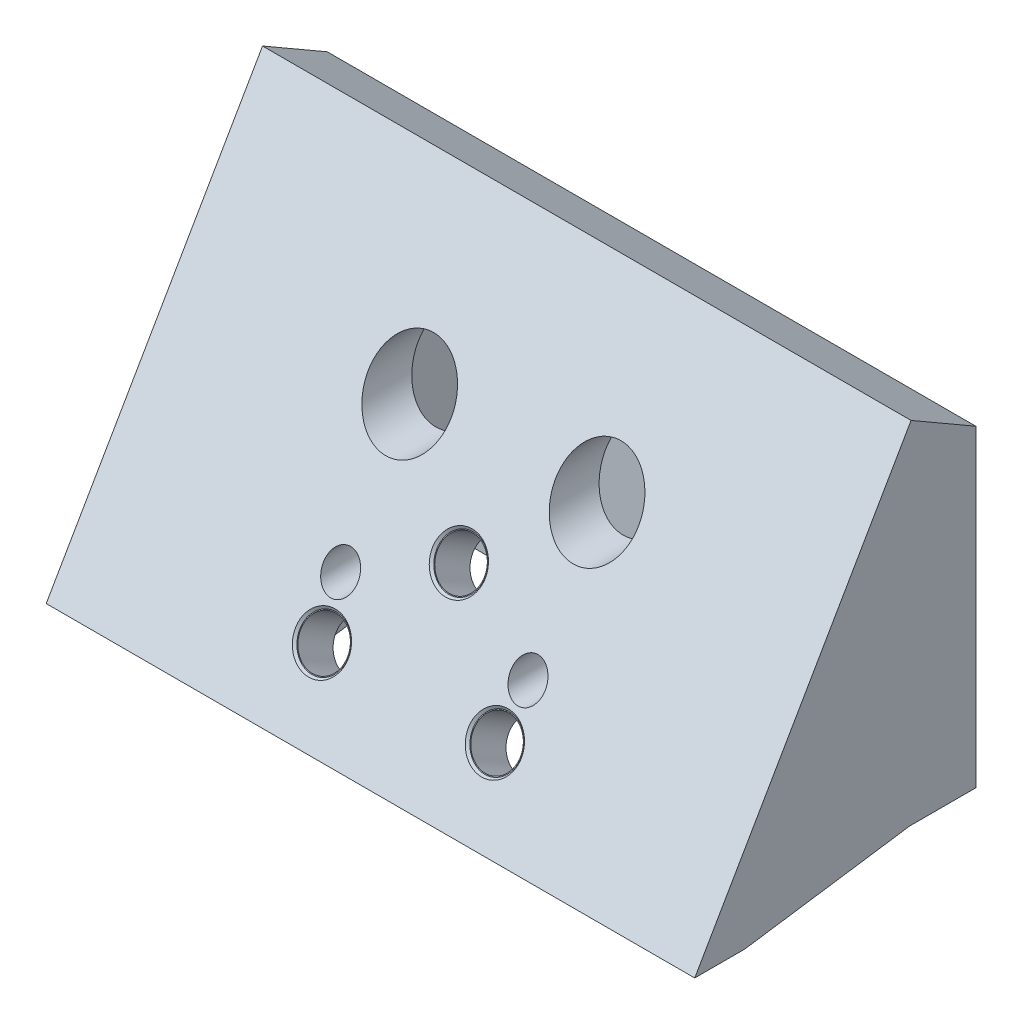
ISO-10303-21;
HEADER;
FILE_DESCRIPTION(('STEP AP214'),'2;1');
FILE_NAME('part.step','',(''),(''),'','','');
FILE_SCHEMA(('AUTOMOTIVE_DESIGN { 1 0 10303 214 1 1 1 1 }'));
ENDSEC;
DATA;
#1=APPLICATION_CONTEXT('core data for automotive mechanical design processes');
#2=APPLICATION_PROTOCOL_DEFINITION('international standard','automotive_design',2000,#1);
#3=PRODUCT_CONTEXT('',#1,'mechanical');
#4=PRODUCT('Part','Part','',(#3));
#5=PRODUCT_RELATED_PRODUCT_CATEGORY('part','',(#4));
#6=PRODUCT_DEFINITION_FORMATION('','',#4);
#7=PRODUCT_DEFINITION_CONTEXT('part definition',#1,'design');
#8=PRODUCT_DEFINITION('design','',#6,#7);
#9=PRODUCT_DEFINITION_SHAPE('','',#8);
#10=(LENGTH_UNIT() NAMED_UNIT(*) SI_UNIT(.MILLI.,.METRE.));
#11=(NAMED_UNIT(*) PLANE_ANGLE_UNIT() SI_UNIT($,.RADIAN.));
#12=(NAMED_UNIT(*) SI_UNIT($,.STERADIAN.) SOLID_ANGLE_UNIT());
#13=UNCERTAINTY_MEASURE_WITH_UNIT(LENGTH_MEASURE(1.E-05),#10,'distance_accuracy_value','');
#14=(GEOMETRIC_REPRESENTATION_CONTEXT(3) GLOBAL_UNCERTAINTY_ASSIGNED_CONTEXT((#13)) GLOBAL_UNIT_ASSIGNED_CONTEXT((#10,
#11,#12)) REPRESENTATION_CONTEXT('',''));
#15=CARTESIAN_POINT('',(0.,0.,0.));
#16=DIRECTION('',(0.,0.,1.));
#17=DIRECTION('',(1.,0.,0.));
#18=AXIS2_PLACEMENT_3D('',#15,#16,#17);
#19=CARTESIAN_POINT('',(20.,3.35000000000049,0.));
#20=DIRECTION('',(0.,-1.,0.));
#21=DIRECTION('',(0.,0.,-1.));
#22=AXIS2_PLACEMENT_3D('',#19,#20,#21);
#23=PLANE('',#22);
#24=DIRECTION('',(-1.,0.,0.));
#25=VECTOR('',#24,1.);
#26=CARTESIAN_POINT('',(20.,3.35000000000048,-26.0785448088665));
#27=LINE('',#26,#25);
#28=CARTESIAN_POINT('',(20.,3.35000000000048,-26.0785448088665));
#29=VERTEX_POINT('',#28);
#30=CARTESIAN_POINT('',(-20.,3.35000000000048,-26.0785448088665));
#31=VERTEX_POINT('',#30);
#32=EDGE_CURVE('E279',#29,#31,#27,.T.);
#33=ORIENTED_EDGE('',*,*,#32,.T.);
#34=DIRECTION('',(0.,0.,1.));
#35=VECTOR('',#34,1.);
#36=CARTESIAN_POINT('',(-20.,3.35000000000049,0.));
#37=LINE('',#36,#35);
#38=CARTESIAN_POINT('',(-20.,3.35000000000048,-22.9035448088665));
#39=VERTEX_POINT('',#38);
#40=EDGE_CURVE('E174',#31,#39,#37,.T.);
#41=ORIENTED_EDGE('',*,*,#40,.T.);
#42=DIRECTION('',(1.,0.,0.));
#43=VECTOR('',#42,1.);
#44=CARTESIAN_POINT('',(-45.,3.35000000000048,-22.9035448088665));
#45=LINE('',#44,#43);
#46=CARTESIAN_POINT('',(-45.,3.35000000000048,-22.9035448088665));
#47=VERTEX_POINT('',#46);
#48=EDGE_CURVE('E167',#47,#39,#45,.T.);
#49=ORIENTED_EDGE('',*,*,#48,.F.);
#50=DIRECTION('',(0.,0.,1.));
#51=VECTOR('',#50,1.);
#52=CARTESIAN_POINT('',(-45.,3.35000000000049,0.));
#53=LINE('',#52,#51);
#54=CARTESIAN_POINT('',(-45.,3.35000000000048,-32.0785448088665));
#55=VERTEX_POINT('',#54);
#56=EDGE_CURVE('E153',#55,#47,#53,.T.);
#57=ORIENTED_EDGE('',*,*,#56,.F.);
#58=DIRECTION('',(-1.,0.,0.));
#59=VECTOR('',#58,1.);
#60=CARTESIAN_POINT('',(20.,3.35000000000048,-32.0785448088665));
#61=LINE('',#60,#59);
#62=CARTESIAN_POINT('',(45.,3.35000000000048,-32.0785448088665));
#63=VERTEX_POINT('',#62);
#64=EDGE_CURVE('E304',#63,#55,#61,.T.);
#65=ORIENTED_EDGE('',*,*,#64,.F.);
#66=DIRECTION('',(0.,0.,-1.));
#67=VECTOR('',#66,1.);
#68=CARTESIAN_POINT('',(45.,3.35000000000049,0.));
#69=LINE('',#68,#67);
#70=CARTESIAN_POINT('',(45.,3.35000000000048,-22.9035448088665));
#71=VERTEX_POINT('',#70);
#72=EDGE_CURVE('E200',#71,#63,#69,.T.);
#73=ORIENTED_EDGE('',*,*,#72,.F.);
#74=DIRECTION('',(-1.,0.,0.));
#75=VECTOR('',#74,1.);
#76=CARTESIAN_POINT('',(45.,3.35000000000048,-22.9035448088665));
#77=LINE('',#76,#75);
#78=CARTESIAN_POINT('',(20.,3.35000000000048,-22.9035448088665));
#79=VERTEX_POINT('',#78);
#80=EDGE_CURVE('E205',#71,#79,#77,.T.);
#81=ORIENTED_EDGE('',*,*,#80,.T.);
#82=DIRECTION('',(0.,0.,-1.));
#83=VECTOR('',#82,1.);
#84=CARTESIAN_POINT('',(20.,3.35000000000049,0.));
#85=LINE('',#84,#83);
#86=EDGE_CURVE('E186',#79,#29,#85,.T.);
#87=ORIENTED_EDGE('',*,*,#86,.T.);
#88=EDGE_LOOP('',(#33,#41,#49,#57,#65,#73,#81,#87));
#89=FACE_BOUND('',#88,.T.);
#90=ADVANCED_FACE('F36',(#89),#23,.T.);
#91=CARTESIAN_POINT('',(20.,0.,-32.0785448088665));
#92=DIRECTION('',(0.,0.,-1.));
#93=DIRECTION('',(0.,1.,0.));
#94=AXIS2_PLACEMENT_3D('',#91,#92,#93);
#95=PLANE('',#94);
#96=CARTESIAN_POINT('',(13.,15.3500000000005,-32.0785448088665));
#97=DIRECTION('',(0.,0.,-1.));
#98=DIRECTION('',(-1.,0.,0.));
#99=AXIS2_PLACEMENT_3D('',#96,#97,#98);
#100=CIRCLE('',#99,2.8067);
#101=CARTESIAN_POINT('',(10.1933,15.3500000000005,-32.0785448088665));
#102=VERTEX_POINT('',#101);
#103=EDGE_CURVE('E255',#102,#102,#100,.T.);
#104=ORIENTED_EDGE('',*,*,#103,.F.);
#105=EDGE_LOOP('',(#104));
#106=FACE_BOUND('',#105,.T.);
#107=CARTESIAN_POINT('',(13.,31.9500000000005,-32.0785448088665));
#108=DIRECTION('',(0.,0.,-1.));
#109=DIRECTION('',(-1.,0.,0.));
#110=AXIS2_PLACEMENT_3D('',#107,#108,#109);
#111=CIRCLE('',#110,2.8067);
#112=CARTESIAN_POINT('',(10.1933,31.9500000000005,-32.0785448088665));
#113=VERTEX_POINT('',#112);
#114=EDGE_CURVE('E259',#113,#113,#111,.T.);
#115=ORIENTED_EDGE('',*,*,#114,.F.);
#116=EDGE_LOOP('',(#115));
#117=FACE_BOUND('',#116,.T.);
#118=CARTESIAN_POINT('',(-13.,31.9500000000005,-32.0785448088665));
#119=DIRECTION('',(0.,0.,-1.));
#120=DIRECTION('',(-1.,0.,0.));
#121=AXIS2_PLACEMENT_3D('',#118,#119,#120);
#122=CIRCLE('',#121,2.8067);
#123=CARTESIAN_POINT('',(-15.8067,31.9500000000005,-32.0785448088665));
#124=VERTEX_POINT('',#123);
#125=EDGE_CURVE('E263',#124,#124,#122,.T.);
#126=ORIENTED_EDGE('',*,*,#125,.F.);
#127=EDGE_LOOP('',(#126));
#128=FACE_BOUND('',#127,.T.);
#129=CARTESIAN_POINT('',(-13.,15.3500000000005,-32.0785448088665));
#130=DIRECTION('',(0.,0.,-1.));
#131=DIRECTION('',(-1.,0.,0.));
#132=AXIS2_PLACEMENT_3D('',#129,#130,#131);
#133=CIRCLE('',#132,2.8067);
#134=CARTESIAN_POINT('',(-15.8067,15.3500000000005,-32.0785448088665));
#135=VERTEX_POINT('',#134);
#136=EDGE_CURVE('E267',#135,#135,#133,.T.);
#137=ORIENTED_EDGE('',*,*,#136,.F.);
#138=EDGE_LOOP('',(#137));
#139=FACE_BOUND('',#138,.T.);
#140=ORIENTED_EDGE('',*,*,#64,.T.);
#141=DIRECTION('',(0.,-1.,0.));
#142=VECTOR('',#141,1.);
#143=CARTESIAN_POINT('',(-45.,0.,-32.0785448088665));
#144=LINE('',#143,#142);
#145=CARTESIAN_POINT('',(-45.,46.8127768527227,-32.0785448088665));
#146=VERTEX_POINT('',#145);
#147=EDGE_CURVE('E179',#146,#55,#144,.T.);
#148=ORIENTED_EDGE('',*,*,#147,.F.);
#149=DIRECTION('',(-1.,0.,0.));
#150=VECTOR('',#149,1.);
#151=CARTESIAN_POINT('',(20.,46.8127768527227,-32.0785448088665));
#152=LINE('',#151,#150);
#153=CARTESIAN_POINT('',(45.,46.8127768527227,-32.0785448088665));
#154=VERTEX_POINT('',#153);
#155=EDGE_CURVE('E302',#154,#146,#152,.T.);
#156=ORIENTED_EDGE('',*,*,#155,.F.);
#157=DIRECTION('',(0.,1.,0.));
#158=VECTOR('',#157,1.);
#159=CARTESIAN_POINT('',(45.,0.,-32.0785448088665));
#160=LINE('',#159,#158);
#161=EDGE_CURVE('E197',#63,#154,#160,.T.);
#162=ORIENTED_EDGE('',*,*,#161,.F.);
#163=EDGE_LOOP('',(#140,#148,#156,#162));
#164=FACE_BOUND('',#163,.T.);
#165=ADVANCED_FACE('F374',(#106,#117,#128,#139,#164),#95,.T.);
#166=CARTESIAN_POINT('',(20.,49.,-28.2901631902915));
#167=DIRECTION('',(0.,-0.86602540378444,0.499999999999998));
#168=DIRECTION('',(0.,-0.499999999999998,-0.86602540378444));
#169=AXIS2_PLACEMENT_3D('',#166,#167,#168);
#170=PLANE('',#169);
#171=ORIENTED_EDGE('',*,*,#155,.T.);
#172=DIRECTION('',(0.,0.499999999999998,0.86602540378444));
#173=VECTOR('',#172,1.);
#174=CARTESIAN_POINT('',(-45.,48.9999999999999,-28.2901631902915));
#175=LINE('',#174,#173);
#176=CARTESIAN_POINT('',(-45.,52.,-23.0940107675848));
#177=VERTEX_POINT('',#176);
#178=EDGE_CURVE('E181',#146,#177,#175,.T.);
#179=ORIENTED_EDGE('',*,*,#178,.T.);
#180=DIRECTION('',(-1.,0.,0.));
#181=VECTOR('',#180,1.);
#182=CARTESIAN_POINT('',(20.,52.,-23.0940107675848));
#183=LINE('',#182,#181);
#184=CARTESIAN_POINT('',(45.,52.,-23.0940107675848));
#185=VERTEX_POINT('',#184);
#186=EDGE_CURVE('E300',#185,#177,#183,.T.);
#187=ORIENTED_EDGE('',*,*,#186,.F.);
#188=DIRECTION('',(0.,-0.499999999999998,-0.86602540378444));
#189=VECTOR('',#188,1.);
#190=CARTESIAN_POINT('',(45.,48.9999999999999,-28.2901631902915));
#191=LINE('',#190,#189);
#192=EDGE_CURVE('E194',#185,#154,#191,.T.);
#193=ORIENTED_EDGE('',*,*,#192,.T.);
#194=EDGE_LOOP('',(#171,#179,#187,#193));
#195=FACE_BOUND('',#194,.T.);
#196=ADVANCED_FACE('F353',(#195),#170,.F.);
#197=CARTESIAN_POINT('',(20.,3.00000000000003,5.19615242270671));
#198=DIRECTION('',(0.,0.499999999999998,0.86602540378444));
#199=DIRECTION('',(0.,-0.86602540378444,0.499999999999998));
#200=AXIS2_PLACEMENT_3D('',#197,#198,#199);
#201=PLANE('',#200);
#202=CARTESIAN_POINT('',(12.,9.12435565298219,1.66025403784448));
#203=DIRECTION('',(0.,0.499999999999998,0.86602540378444));
#204=DIRECTION('',(0.,-0.86602540378444,0.499999999999998));
#205=AXIS2_PLACEMENT_3D('',#202,#203,#204);
#206=CIRCLE('',#205,3.67891460743347);
#207=CARTESIAN_POINT('',(12.,5.93832214459114,3.49971134156121));
#208=VERTEX_POINT('',#207);
#209=EDGE_CURVE('E39',#208,#208,#206,.T.);
#210=ORIENTED_EDGE('',*,*,#209,.F.);
#211=EDGE_LOOP('',(#210));
#212=FACE_BOUND('',#211,.T.);
#213=CARTESIAN_POINT('',(-12.,9.12435565298219,1.66025403784448));
#214=DIRECTION('',(0.,0.499999999999998,0.86602540378444));
#215=DIRECTION('',(0.,-0.86602540378444,0.499999999999998));
#216=AXIS2_PLACEMENT_3D('',#213,#214,#215);
#217=CIRCLE('',#216,3.67891460743347);
#218=CARTESIAN_POINT('',(-12.,5.93832214459114,3.49971134156121));
#219=VERTEX_POINT('',#218);
#220=EDGE_CURVE('E231',#219,#219,#217,.T.);
#221=ORIENTED_EDGE('',*,*,#220,.F.);
#222=EDGE_LOOP('',(#221));
#223=FACE_BOUND('',#222,.T.);
#224=CARTESIAN_POINT('',(0.,21.2487113059643,-5.33974596215549));
#225=DIRECTION('',(0.,0.499999999999998,0.86602540378444));
#226=DIRECTION('',(0.,-0.86602540378444,0.499999999999998));
#227=AXIS2_PLACEMENT_3D('',#224,#225,#226);
#228=CIRCLE('',#227,3.67891460743347);
#229=CARTESIAN_POINT('',(0.,18.0626777975733,-3.50028865843877));
#230=VERTEX_POINT('',#229);
#231=EDGE_CURVE('E237',#230,#230,#228,.T.);
#232=ORIENTED_EDGE('',*,*,#231,.F.);
#233=EDGE_LOOP('',(#232));
#234=FACE_BOUND('',#233,.T.);
#235=CARTESIAN_POINT('',(13.,31.9500000000005,-11.5181378703331));
#236=DIRECTION('',(0.,0.499999999999998,0.86602540378444));
#237=DIRECTION('',(0.,0.86602540378444,-0.499999999999998));
#238=AXIS2_PLACEMENT_3D('',#235,#236,#237);
#239=ELLIPSE('',#238,6.63952809568069,5.75);
#240=CARTESIAN_POINT('',(13.,37.7000000000005,-14.8379019181735));
#241=VERTEX_POINT('',#240);
#242=EDGE_CURVE('E236',#241,#241,#239,.T.);
#243=ORIENTED_EDGE('',*,*,#242,.F.);
#244=EDGE_LOOP('',(#243));
#245=FACE_BOUND('',#244,.T.);
#246=CARTESIAN_POINT('',(-13.,31.9500000000005,-11.5181378703331));
#247=DIRECTION('',(0.,0.499999999999998,0.86602540378444));
#248=DIRECTION('',(0.,0.86602540378444,-0.499999999999998));
#249=AXIS2_PLACEMENT_3D('',#246,#247,#248);
#250=ELLIPSE('',#249,6.63952809568069,5.75);
#251=CARTESIAN_POINT('',(-13.,37.7000000000005,-14.8379019181735));
#252=VERTEX_POINT('',#251);
#253=EDGE_CURVE('E244',#252,#252,#250,.T.);
#254=ORIENTED_EDGE('',*,*,#253,.F.);
#255=EDGE_LOOP('',(#254));
#256=FACE_BOUND('',#255,.T.);
#257=CARTESIAN_POINT('',(-13.,15.3500000000005,-1.93412340178539));
#258=DIRECTION('',(0.,0.499999999999998,0.86602540378444));
#259=DIRECTION('',(0.,0.86602540378444,-0.499999999999998));
#260=AXIS2_PLACEMENT_3D('',#257,#258,#259);
#261=ELLIPSE('',#260,2.77128129211019,2.39999999999999);
#262=CARTESIAN_POINT('',(-13.,17.7500000000005,-3.31976404784048));
#263=VERTEX_POINT('',#262);
#264=EDGE_CURVE('E248',#263,#263,#261,.T.);
#265=ORIENTED_EDGE('',*,*,#264,.F.);
#266=EDGE_LOOP('',(#265));
#267=FACE_BOUND('',#266,.T.);
#268=CARTESIAN_POINT('',(13.,15.3500000000005,-1.93412340178539));
#269=DIRECTION('',(0.,0.499999999999998,0.86602540378444));
#270=DIRECTION('',(0.,0.86602540378444,-0.499999999999998));
#271=AXIS2_PLACEMENT_3D('',#268,#269,#270);
#272=ELLIPSE('',#271,2.77128129211019,2.39999999999999);
#273=CARTESIAN_POINT('',(13.,17.7500000000005,-3.31976404784048));
#274=VERTEX_POINT('',#273);
#275=EDGE_CURVE('E251',#274,#274,#272,.T.);
#276=ORIENTED_EDGE('',*,*,#275,.F.);
#277=EDGE_LOOP('',(#276));
#278=FACE_BOUND('',#277,.T.);
#279=ORIENTED_EDGE('',*,*,#186,.T.);
#280=DIRECTION('',(0.,0.86602540378444,-0.499999999999998));
#281=VECTOR('',#280,1.);
#282=CARTESIAN_POINT('',(-45.,3.00000000000003,5.19615242270671));
#283=LINE('',#282,#281);
#284=CARTESIAN_POINT('',(-45.,0.,6.9282032302756));
#285=VERTEX_POINT('',#284);
#286=EDGE_CURVE('E168',#285,#177,#283,.T.);
#287=ORIENTED_EDGE('',*,*,#286,.F.);
#288=DIRECTION('',(-1.,0.,0.));
#289=VECTOR('',#288,1.);
#290=CARTESIAN_POINT('',(20.,0.,6.9282032302756));
#291=LINE('',#290,#289);
#292=CARTESIAN_POINT('',(45.,0.,6.9282032302756));
#293=VERTEX_POINT('',#292);
#294=EDGE_CURVE('E172',#293,#285,#291,.T.);
#295=ORIENTED_EDGE('',*,*,#294,.F.);
#296=DIRECTION('',(0.,-0.86602540378444,0.499999999999998));
#297=VECTOR('',#296,1.);
#298=CARTESIAN_POINT('',(45.,3.00000000000003,5.19615242270671));
#299=LINE('',#298,#297);
#300=EDGE_CURVE('E190',#185,#293,#299,.T.);
#301=ORIENTED_EDGE('',*,*,#300,.F.);
#302=EDGE_LOOP('',(#279,#287,#295,#301));
#303=FACE_BOUND('',#302,.T.);
#304=ADVANCED_FACE('F350',(#212,#223,#234,#245,#256,#267,#278,#303),#201,.T.);
#305=CARTESIAN_POINT('',(20.,0.,0.));
#306=DIRECTION('',(0.,1.,0.));
#307=DIRECTION('',(0.,0.,1.));
#308=AXIS2_PLACEMENT_3D('',#305,#306,#307);
#309=PLANE('',#308);
#310=ORIENTED_EDGE('',*,*,#294,.T.);
#311=DIRECTION('',(0.,0.,-1.));
#312=VECTOR('',#311,1.);
#313=CARTESIAN_POINT('',(-45.,0.,0.));
#314=LINE('',#313,#312);
#315=CARTESIAN_POINT('',(-45.,0.,0.));
#316=VERTEX_POINT('',#315);
#317=EDGE_CURVE('E150',#285,#316,#314,.T.);
#318=ORIENTED_EDGE('',*,*,#317,.T.);
#319=DIRECTION('',(1.,0.,0.));
#320=VECTOR('',#319,1.);
#321=CARTESIAN_POINT('',(-45.,0.,0.));
#322=LINE('',#321,#320);
#323=CARTESIAN_POINT('',(-20.,0.,0.));
#324=VERTEX_POINT('',#323);
#325=EDGE_CURVE('E160',#316,#324,#322,.T.);
#326=ORIENTED_EDGE('',*,*,#325,.T.);
#327=DIRECTION('',(-1.,0.,0.));
#328=VECTOR('',#327,1.);
#329=CARTESIAN_POINT('',(20.,0.,0.));
#330=LINE('',#329,#328);
#331=CARTESIAN_POINT('',(20.,0.,0.));
#332=VERTEX_POINT('',#331);
#333=EDGE_CURVE('E296',#332,#324,#330,.T.);
#334=ORIENTED_EDGE('',*,*,#333,.F.);
#335=DIRECTION('',(-1.,0.,0.));
#336=VECTOR('',#335,1.);
#337=CARTESIAN_POINT('',(45.,0.,0.));
#338=LINE('',#337,#336);
#339=CARTESIAN_POINT('',(45.,0.,0.));
#340=VERTEX_POINT('',#339);
#341=EDGE_CURVE('E209',#340,#332,#338,.T.);
#342=ORIENTED_EDGE('',*,*,#341,.F.);
#343=DIRECTION('',(0.,0.,1.));
#344=VECTOR('',#343,1.);
#345=CARTESIAN_POINT('',(45.,0.,0.));
#346=LINE('',#345,#344);
#347=EDGE_CURVE('E188',#340,#293,#346,.T.);
#348=ORIENTED_EDGE('',*,*,#347,.T.);
#349=EDGE_LOOP('',(#310,#318,#326,#334,#342,#348));
#350=FACE_BOUND('',#349,.T.);
#351=ADVANCED_FACE('F170',(#350),#309,.F.);
#352=CARTESIAN_POINT('',(20.,0.,0.));
#353=DIRECTION('',(0.,0.499999999999996,0.866025403784441));
#354=DIRECTION('',(0.,-0.866025403784441,0.499999999999996));
#355=AXIS2_PLACEMENT_3D('',#352,#353,#354);
#356=PLANE('',#355);
#357=CARTESIAN_POINT('',(12.,6.12435565298217,-3.53589838486222));
#358=DIRECTION('',(0.,0.499999999999996,0.866025403784441));
#359=DIRECTION('',(0.,-0.866025403784441,0.499999999999996));
#360=AXIS2_PLACEMENT_3D('',#357,#358,#359);
#361=CIRCLE('',#360,3.2639);
#362=CARTESIAN_POINT('',(12.,3.29773533757013,-1.90394838486224));
#363=VERTEX_POINT('',#362);
#364=EDGE_CURVE('E219',#363,#363,#361,.T.);
#365=ORIENTED_EDGE('',*,*,#364,.T.);
#366=EDGE_LOOP('',(#365));
#367=FACE_BOUND('',#366,.T.);
#368=CARTESIAN_POINT('',(-12.,6.12435565298217,-3.53589838486222));
#369=DIRECTION('',(0.,0.499999999999996,0.866025403784441));
#370=DIRECTION('',(0.,-0.866025403784441,0.499999999999996));
#371=AXIS2_PLACEMENT_3D('',#368,#369,#370);
#372=CIRCLE('',#371,3.2639);
#373=CARTESIAN_POINT('',(-12.,3.29773533757013,-1.90394838486224));
#374=VERTEX_POINT('',#373);
#375=EDGE_CURVE('E226',#374,#374,#372,.T.);
#376=ORIENTED_EDGE('',*,*,#375,.T.);
#377=EDGE_LOOP('',(#376));
#378=FACE_BOUND('',#377,.T.);
#379=CARTESIAN_POINT('',(0.,18.2487113059643,-10.5358983848622));
#380=DIRECTION('',(0.,0.499999999999996,0.866025403784441));
#381=DIRECTION('',(0.,-0.866025403784441,0.499999999999996));
#382=AXIS2_PLACEMENT_3D('',#379,#380,#381);
#383=CIRCLE('',#382,3.2639);
#384=CARTESIAN_POINT('',(0.,15.4220909905523,-8.90394838486218));
#385=VERTEX_POINT('',#384);
#386=EDGE_CURVE('E234',#385,#385,#383,.T.);
#387=ORIENTED_EDGE('',*,*,#386,.T.);
#388=EDGE_LOOP('',(#387));
#389=FACE_BOUND('',#388,.T.);
#390=CARTESIAN_POINT('',(-13.,15.3500000000005,-8.86232663206094));
#391=DIRECTION('',(0.,0.499999999999996,0.866025403784441));
#392=DIRECTION('',(0.,0.866025403784441,-0.499999999999996));
#393=AXIS2_PLACEMENT_3D('',#390,#391,#392);
#394=ELLIPSE('',#393,2.77128129211019,2.39999999999999);
#395=CARTESIAN_POINT('',(-13.,17.7500000000005,-10.247967278116));
#396=VERTEX_POINT('',#395);
#397=EDGE_CURVE('E247',#396,#396,#394,.T.);
#398=ORIENTED_EDGE('',*,*,#397,.T.);
#399=EDGE_LOOP('',(#398));
#400=FACE_BOUND('',#399,.T.);
#401=CARTESIAN_POINT('',(13.,15.3500000000005,-8.86232663206094));
#402=DIRECTION('',(0.,0.499999999999996,0.866025403784441));
#403=DIRECTION('',(0.,0.866025403784441,-0.499999999999996));
#404=AXIS2_PLACEMENT_3D('',#401,#402,#403);
#405=ELLIPSE('',#404,2.77128129211019,2.39999999999999);
#406=CARTESIAN_POINT('',(13.,17.7500000000005,-10.247967278116));
#407=VERTEX_POINT('',#406);
#408=EDGE_CURVE('E252',#407,#407,#405,.T.);
#409=ORIENTED_EDGE('',*,*,#408,.T.);
#410=EDGE_LOOP('',(#409));
#411=FACE_BOUND('',#410,.T.);
#412=DIRECTION('',(-1.,0.,0.));
#413=VECTOR('',#412,1.);
#414=CARTESIAN_POINT('',(20.,37.5764973081042,-21.694800836037));
#415=LINE('',#414,#413);
#416=CARTESIAN_POINT('',(11.8146612121839,37.5764973081042,-21.694800836037));
#417=VERTEX_POINT('',#416);
#418=CARTESIAN_POINT('',(-11.8146612121838,37.5764973081042,-21.694800836037));
#419=VERTEX_POINT('',#418);
#420=EDGE_CURVE('E297',#417,#419,#415,.T.);
#421=ORIENTED_EDGE('',*,*,#420,.F.);
#422=CARTESIAN_POINT('',(13.,31.9500000000005,-18.4463411006086));
#423=DIRECTION('',(0.,0.499999999999996,0.866025403784441));
#424=DIRECTION('',(0.,0.866025403784441,-0.499999999999996));
#425=AXIS2_PLACEMENT_3D('',#422,#423,#424);
#426=ELLIPSE('',#425,6.63952809568068,5.75);
#427=CARTESIAN_POINT('',(14.1853387878162,37.5764973081042,-21.694800836037));
#428=VERTEX_POINT('',#427);
#429=EDGE_CURVE('E11',#417,#428,#426,.T.);
#430=ORIENTED_EDGE('',*,*,#429,.T.);
#431=CARTESIAN_POINT('',(20.,37.5764973081042,-21.694800836037));
#432=VERTEX_POINT('',#431);
#433=EDGE_CURVE('E293',#432,#428,#415,.T.);
#434=ORIENTED_EDGE('',*,*,#433,.F.);
#435=DIRECTION('',(0.,0.866025403784441,-0.499999999999996));
#436=VECTOR('',#435,1.);
#437=CARTESIAN_POINT('',(20.,0.,0.));
#438=LINE('',#437,#436);
#439=EDGE_CURVE('E271',#332,#432,#438,.T.);
#440=ORIENTED_EDGE('',*,*,#439,.F.);
#441=ORIENTED_EDGE('',*,*,#333,.T.);
#442=DIRECTION('',(0.,0.866025403784441,-0.499999999999996));
#443=VECTOR('',#442,1.);
#444=CARTESIAN_POINT('',(-20.,0.,0.));
#445=LINE('',#444,#443);
#446=CARTESIAN_POINT('',(-20.,37.5764973081042,-21.694800836037));
#447=VERTEX_POINT('',#446);
#448=EDGE_CURVE('E280',#324,#447,#445,.T.);
#449=ORIENTED_EDGE('',*,*,#448,.T.);
#450=CARTESIAN_POINT('',(-14.1853387878164,37.5764973081042,-21.694800836037));
#451=VERTEX_POINT('',#450);
#452=EDGE_CURVE('E292',#451,#447,#415,.T.);
#453=ORIENTED_EDGE('',*,*,#452,.F.);
#454=CARTESIAN_POINT('',(-13.,31.9500000000005,-18.4463411006086));
#455=DIRECTION('',(0.,0.499999999999996,0.866025403784441));
#456=DIRECTION('',(0.,0.866025403784441,-0.499999999999996));
#457=AXIS2_PLACEMENT_3D('',#454,#455,#456);
#458=ELLIPSE('',#457,6.63952809568068,5.75);
#459=EDGE_CURVE('E59',#451,#419,#458,.T.);
#460=ORIENTED_EDGE('',*,*,#459,.T.);
#461=EDGE_LOOP('',(#421,#430,#434,#440,#441,#449,#453,#460));
#462=FACE_BOUND('',#461,.T.);
#463=ADVANCED_FACE('F383',(#367,#378,#389,#400,#411,#462),#356,.F.);
#464=CARTESIAN_POINT('',(20.,37.5764973081043,-2.15710964407993E-13));
#465=DIRECTION('',(0.,1.,0.));
#466=DIRECTION('',(0.,0.,1.));
#467=AXIS2_PLACEMENT_3D('',#464,#465,#466);
#468=PLANE('',#467);
#469=ORIENTED_EDGE('',*,*,#433,.T.);
#470=DIRECTION('',(0.,0.,-1.));
#471=VECTOR('',#470,1.);
#472=CARTESIAN_POINT('',(14.1853387878165,37.5764973081042,-32.0785448088665));
#473=LINE('',#472,#471);
#474=CARTESIAN_POINT('',(14.1853387878162,37.5764973081042,-22.9035448088665));
#475=VERTEX_POINT('',#474);
#476=EDGE_CURVE('E44',#428,#475,#473,.T.);
#477=ORIENTED_EDGE('',*,*,#476,.T.);
#478=DIRECTION('',(-1.,0.,0.));
#479=VECTOR('',#478,1.);
#480=CARTESIAN_POINT('',(20.,37.5764973081042,-22.9035448088665));
#481=LINE('',#480,#479);
#482=CARTESIAN_POINT('',(11.8146612121838,37.5764973081042,-22.9035448088665));
#483=VERTEX_POINT('',#482);
#484=EDGE_CURVE('E326',#475,#483,#481,.T.);
#485=ORIENTED_EDGE('',*,*,#484,.T.);
#486=DIRECTION('',(0.,0.,-1.));
#487=VECTOR('',#486,1.);
#488=CARTESIAN_POINT('',(11.8146612121835,37.5764973081042,-32.0785448088665));
#489=LINE('',#488,#487);
#490=EDGE_CURVE('E329',#483,#417,#489,.F.);
#491=ORIENTED_EDGE('',*,*,#490,.T.);
#492=ORIENTED_EDGE('',*,*,#420,.T.);
#493=DIRECTION('',(0.,0.,-1.));
#494=VECTOR('',#493,1.);
#495=CARTESIAN_POINT('',(-11.8146612121836,37.5764973081042,-32.0785448088665));
#496=LINE('',#495,#494);
#497=CARTESIAN_POINT('',(-11.8146612121836,37.5764973081042,-22.9035448088665));
#498=VERTEX_POINT('',#497);
#499=EDGE_CURVE('E323',#419,#498,#496,.T.);
#500=ORIENTED_EDGE('',*,*,#499,.T.);
#501=DIRECTION('',(-1.,0.,0.));
#502=VECTOR('',#501,1.);
#503=CARTESIAN_POINT('',(20.,37.5764973081042,-22.9035448088665));
#504=LINE('',#503,#502);
#505=CARTESIAN_POINT('',(-14.1853387878164,37.5764973081042,-22.9035448088665));
#506=VERTEX_POINT('',#505);
#507=EDGE_CURVE('E320',#498,#506,#504,.T.);
#508=ORIENTED_EDGE('',*,*,#507,.T.);
#509=DIRECTION('',(0.,0.,-1.));
#510=VECTOR('',#509,1.);
#511=CARTESIAN_POINT('',(-14.1853387878164,37.5764973081042,-32.0785448088665));
#512=LINE('',#511,#510);
#513=EDGE_CURVE('E306',#506,#451,#512,.F.);
#514=ORIENTED_EDGE('',*,*,#513,.T.);
#515=ORIENTED_EDGE('',*,*,#452,.T.);
#516=DIRECTION('',(0.,0.,-1.));
#517=VECTOR('',#516,1.);
#518=CARTESIAN_POINT('',(-20.,37.5764973081043,-2.15710964407993E-13));
#519=LINE('',#518,#517);
#520=CARTESIAN_POINT('',(-20.,37.5764973081042,-26.0785448088665));
#521=VERTEX_POINT('',#520);
#522=EDGE_CURVE('E283',#447,#521,#519,.T.);
#523=ORIENTED_EDGE('',*,*,#522,.T.);
#524=DIRECTION('',(-1.,0.,0.));
#525=VECTOR('',#524,1.);
#526=CARTESIAN_POINT('',(20.,37.5764973081042,-26.0785448088665));
#527=LINE('',#526,#525);
#528=CARTESIAN_POINT('',(20.,37.5764973081042,-26.0785448088665));
#529=VERTEX_POINT('',#528);
#530=EDGE_CURVE('E289',#529,#521,#527,.T.);
#531=ORIENTED_EDGE('',*,*,#530,.F.);
#532=DIRECTION('',(0.,0.,-1.));
#533=VECTOR('',#532,1.);
#534=CARTESIAN_POINT('',(20.,37.5764973081043,-2.15710964407993E-13));
#535=LINE('',#534,#533);
#536=EDGE_CURVE('E273',#432,#529,#535,.T.);
#537=ORIENTED_EDGE('',*,*,#536,.F.);
#538=EDGE_LOOP('',(#469,#477,#485,#491,#492,#500,#508,#514,#515,#523,#531,#537));
#539=FACE_BOUND('',#538,.T.);
#540=ADVANCED_FACE('F404',(#539),#468,.F.);
#541=CARTESIAN_POINT('',(20.,0.,-26.0785448088665));
#542=DIRECTION('',(0.,0.,1.));
#543=DIRECTION('',(0.,-1.,0.));
#544=AXIS2_PLACEMENT_3D('',#541,#542,#543);
#545=PLANE('',#544);
#546=CARTESIAN_POINT('',(13.,15.3500000000005,-26.0785448088665));
#547=DIRECTION('',(0.,0.,1.));
#548=DIRECTION('',(0.,-1.,0.));
#549=AXIS2_PLACEMENT_3D('',#546,#547,#548);
#550=CIRCLE('',#549,2.8067);
#551=CARTESIAN_POINT('',(13.,12.5433000000005,-26.0785448088665));
#552=VERTEX_POINT('',#551);
#553=EDGE_CURVE('E258',#552,#552,#550,.T.);
#554=ORIENTED_EDGE('',*,*,#553,.F.);
#555=EDGE_LOOP('',(#554));
#556=FACE_BOUND('',#555,.T.);
#557=CARTESIAN_POINT('',(13.,31.9500000000005,-26.0785448088665));
#558=DIRECTION('',(0.,0.,1.));
#559=DIRECTION('',(0.,-1.,0.));
#560=AXIS2_PLACEMENT_3D('',#557,#558,#559);
#561=CIRCLE('',#560,2.8067);
#562=CARTESIAN_POINT('',(13.,29.1433000000005,-26.0785448088665));
#563=VERTEX_POINT('',#562);
#564=EDGE_CURVE('E262',#563,#563,#561,.T.);
#565=ORIENTED_EDGE('',*,*,#564,.F.);
#566=EDGE_LOOP('',(#565));
#567=FACE_BOUND('',#566,.T.);
#568=CARTESIAN_POINT('',(-13.,31.9500000000005,-26.0785448088665));
#569=DIRECTION('',(0.,0.,1.));
#570=DIRECTION('',(0.,-1.,0.));
#571=AXIS2_PLACEMENT_3D('',#568,#569,#570);
#572=CIRCLE('',#571,2.8067);
#573=CARTESIAN_POINT('',(-13.,29.1433000000005,-26.0785448088665));
#574=VERTEX_POINT('',#573);
#575=EDGE_CURVE('E266',#574,#574,#572,.T.);
#576=ORIENTED_EDGE('',*,*,#575,.F.);
#577=EDGE_LOOP('',(#576));
#578=FACE_BOUND('',#577,.T.);
#579=CARTESIAN_POINT('',(-13.,15.3500000000005,-26.0785448088665));
#580=DIRECTION('',(0.,0.,1.));
#581=DIRECTION('',(0.,-1.,0.));
#582=AXIS2_PLACEMENT_3D('',#579,#580,#581);
#583=CIRCLE('',#582,2.8067);
#584=CARTESIAN_POINT('',(-13.,12.5433000000005,-26.0785448088665));
#585=VERTEX_POINT('',#584);
#586=EDGE_CURVE('E270',#585,#585,#583,.T.);
#587=ORIENTED_EDGE('',*,*,#586,.F.);
#588=EDGE_LOOP('',(#587));
#589=FACE_BOUND('',#588,.T.);
#590=DIRECTION('',(0.,1.,0.));
#591=VECTOR('',#590,1.);
#592=CARTESIAN_POINT('',(-20.,0.,-26.0785448088665));
#593=LINE('',#592,#591);
#594=EDGE_CURVE('E274',#31,#521,#593,.T.);
#595=ORIENTED_EDGE('',*,*,#594,.F.);
#596=ORIENTED_EDGE('',*,*,#32,.F.);
#597=DIRECTION('',(0.,1.,0.));
#598=VECTOR('',#597,1.);
#599=CARTESIAN_POINT('',(20.,0.,-26.0785448088665));
#600=LINE('',#599,#598);
#601=EDGE_CURVE('E276',#29,#529,#600,.T.);
#602=ORIENTED_EDGE('',*,*,#601,.T.);
#603=ORIENTED_EDGE('',*,*,#530,.T.);
#604=EDGE_LOOP('',(#595,#596,#602,#603));
#605=FACE_BOUND('',#604,.T.);
#606=ADVANCED_FACE('F402',(#556,#567,#578,#589,#605),#545,.T.);
#607=CARTESIAN_POINT('',(-13.,15.3500000000005,-32.0785448088665));
#608=DIRECTION('',(0.,0.,-1.));
#609=DIRECTION('',(-1.,0.,0.));
#610=AXIS2_PLACEMENT_3D('',#607,#608,#609);
#611=CYLINDRICAL_SURFACE('',#610,2.8067);
#612=ORIENTED_EDGE('',*,*,#586,.T.);
#613=EDGE_LOOP('',(#612));
#614=FACE_BOUND('',#613,.T.);
#615=ORIENTED_EDGE('',*,*,#136,.T.);
#616=EDGE_LOOP('',(#615));
#617=FACE_BOUND('',#616,.T.);
#618=ADVANCED_FACE('F442',(#614,#617),#611,.F.);
#619=CARTESIAN_POINT('',(-13.,31.9500000000005,-32.0785448088665));
#620=DIRECTION('',(0.,0.,-1.));
#621=DIRECTION('',(-1.,0.,0.));
#622=AXIS2_PLACEMENT_3D('',#619,#620,#621);
#623=CYLINDRICAL_SURFACE('',#622,2.8067);
#624=ORIENTED_EDGE('',*,*,#575,.T.);
#625=EDGE_LOOP('',(#624));
#626=FACE_BOUND('',#625,.T.);
#627=ORIENTED_EDGE('',*,*,#125,.T.);
#628=EDGE_LOOP('',(#627));
#629=FACE_BOUND('',#628,.T.);
#630=ADVANCED_FACE('F446',(#626,#629),#623,.F.);
#631=CARTESIAN_POINT('',(13.,31.9500000000005,-32.0785448088665));
#632=DIRECTION('',(0.,0.,-1.));
#633=DIRECTION('',(-1.,0.,0.));
#634=AXIS2_PLACEMENT_3D('',#631,#632,#633);
#635=CYLINDRICAL_SURFACE('',#634,2.8067);
#636=ORIENTED_EDGE('',*,*,#564,.T.);
#637=EDGE_LOOP('',(#636));
#638=FACE_BOUND('',#637,.T.);
#639=ORIENTED_EDGE('',*,*,#114,.T.);
#640=EDGE_LOOP('',(#639));
#641=FACE_BOUND('',#640,.T.);
#642=ADVANCED_FACE('F450',(#638,#641),#635,.F.);
#643=CARTESIAN_POINT('',(13.,15.3500000000005,-32.0785448088665));
#644=DIRECTION('',(0.,0.,-1.));
#645=DIRECTION('',(-1.,0.,0.));
#646=AXIS2_PLACEMENT_3D('',#643,#644,#645);
#647=CYLINDRICAL_SURFACE('',#646,2.8067);
#648=ORIENTED_EDGE('',*,*,#553,.T.);
#649=EDGE_LOOP('',(#648));
#650=FACE_BOUND('',#649,.T.);
#651=ORIENTED_EDGE('',*,*,#103,.T.);
#652=EDGE_LOOP('',(#651));
#653=FACE_BOUND('',#652,.T.);
#654=ADVANCED_FACE('F454',(#650,#653),#647,.F.);
#655=CARTESIAN_POINT('',(13.,15.3500000000005,-32.0785448088665));
#656=DIRECTION('',(0.,0.,-1.));
#657=DIRECTION('',(-1.,0.,0.));
#658=AXIS2_PLACEMENT_3D('',#655,#656,#657);
#659=CYLINDRICAL_SURFACE('',#658,2.39999999999999);
#660=ORIENTED_EDGE('',*,*,#275,.T.);
#661=EDGE_LOOP('',(#660));
#662=FACE_BOUND('',#661,.T.);
#663=ORIENTED_EDGE('',*,*,#408,.F.);
#664=EDGE_LOOP('',(#663));
#665=FACE_BOUND('',#664,.T.);
#666=ADVANCED_FACE('F419',(#662,#665),#659,.F.);
#667=CARTESIAN_POINT('',(-13.,15.3500000000005,-32.0785448088665));
#668=DIRECTION('',(0.,0.,-1.));
#669=DIRECTION('',(-1.,0.,0.));
#670=AXIS2_PLACEMENT_3D('',#667,#668,#669);
#671=CYLINDRICAL_SURFACE('',#670,2.39999999999999);
#672=ORIENTED_EDGE('',*,*,#264,.T.);
#673=EDGE_LOOP('',(#672));
#674=FACE_BOUND('',#673,.T.);
#675=ORIENTED_EDGE('',*,*,#397,.F.);
#676=EDGE_LOOP('',(#675));
#677=FACE_BOUND('',#676,.T.);
#678=ADVANCED_FACE('F410',(#674,#677),#671,.F.);
#679=CARTESIAN_POINT('',(-12.5,31.9500000000005,-22.9035448088665));
#680=DIRECTION('',(0.,0.,-1.));
#681=DIRECTION('',(-1.,0.,0.));
#682=AXIS2_PLACEMENT_3D('',#679,#680,#681);
#683=PLANE('',#682);
#684=CARTESIAN_POINT('',(-13.,31.9500000000005,-22.9035448088665));
#685=DIRECTION('',(0.,0.,-1.));
#686=DIRECTION('',(-1.,0.,0.));
#687=AXIS2_PLACEMENT_3D('',#684,#685,#686);
#688=CIRCLE('',#687,5.75);
#689=EDGE_CURVE('E240',#506,#498,#688,.T.);
#690=ORIENTED_EDGE('',*,*,#689,.F.);
#691=ORIENTED_EDGE('',*,*,#507,.F.);
#692=EDGE_LOOP('',(#690,#691));
#693=FACE_BOUND('',#692,.T.);
#694=ADVANCED_FACE('F408',(#693),#683,.F.);
#695=CARTESIAN_POINT('',(-13.,31.9500000000005,-32.0785448088665));
#696=DIRECTION('',(0.,0.,-1.));
#697=DIRECTION('',(-1.,0.,0.));
#698=AXIS2_PLACEMENT_3D('',#695,#696,#697);
#699=CYLINDRICAL_SURFACE('',#698,5.75);
#700=ORIENTED_EDGE('',*,*,#253,.T.);
#701=EDGE_LOOP('',(#700));
#702=FACE_BOUND('',#701,.T.);
#703=ORIENTED_EDGE('',*,*,#459,.F.);
#704=ORIENTED_EDGE('',*,*,#513,.F.);
#705=ORIENTED_EDGE('',*,*,#689,.T.);
#706=ORIENTED_EDGE('',*,*,#499,.F.);
#707=EDGE_LOOP('',(#703,#704,#705,#706));
#708=FACE_BOUND('',#707,.T.);
#709=ADVANCED_FACE('F405',(#702,#708),#699,.F.);
#710=CARTESIAN_POINT('',(13.,31.9500000000005,-32.0785448088665));
#711=DIRECTION('',(0.,0.,-1.));
#712=DIRECTION('',(-1.,0.,0.));
#713=AXIS2_PLACEMENT_3D('',#710,#711,#712);
#714=CYLINDRICAL_SURFACE('',#713,5.75);
#715=ORIENTED_EDGE('',*,*,#242,.T.);
#716=EDGE_LOOP('',(#715));
#717=FACE_BOUND('',#716,.T.);
#718=ORIENTED_EDGE('',*,*,#429,.F.);
#719=ORIENTED_EDGE('',*,*,#490,.F.);
#720=CARTESIAN_POINT('',(13.,31.9500000000005,-22.9035448088665));
#721=DIRECTION('',(0.,0.,-1.));
#722=DIRECTION('',(-1.,0.,0.));
#723=AXIS2_PLACEMENT_3D('',#720,#721,#722);
#724=CIRCLE('',#723,5.75);
#725=EDGE_CURVE('E51',#483,#475,#724,.T.);
#726=ORIENTED_EDGE('',*,*,#725,.T.);
#727=ORIENTED_EDGE('',*,*,#476,.F.);
#728=EDGE_LOOP('',(#718,#719,#726,#727));
#729=FACE_BOUND('',#728,.T.);
#730=ADVANCED_FACE('F416',(#717,#729),#714,.F.);
#731=CARTESIAN_POINT('',(13.5,31.9500000000005,-22.9035448088665));
#732=DIRECTION('',(0.,0.,-1.));
#733=DIRECTION('',(-1.,0.,0.));
#734=AXIS2_PLACEMENT_3D('',#731,#732,#733);
#735=PLANE('',#734);
#736=ORIENTED_EDGE('',*,*,#725,.F.);
#737=ORIENTED_EDGE('',*,*,#484,.F.);
#738=EDGE_LOOP('',(#736,#737));
#739=FACE_BOUND('',#738,.T.);
#740=ADVANCED_FACE('F495',(#739),#735,.F.);
#741=CARTESIAN_POINT('',(0.,22.8362113059643,-2.59011530513989));
#742=DIRECTION('',(0.,0.499999999999998,0.86602540378444));
#743=DIRECTION('',(0.,-0.86602540378444,0.499999999999998));
#744=AXIS2_PLACEMENT_3D('',#741,#742,#743);
#745=CYLINDRICAL_SURFACE('',#744,3.2639);
#746=CARTESIAN_POINT('',(0.,21.0757450139737,-5.63933236788012));
#747=DIRECTION('',(0.,0.499999999999998,0.86602540378444));
#748=DIRECTION('',(0.,-0.86602540378444,0.499999999999998));
#749=AXIS2_PLACEMENT_3D('',#746,#747,#748);
#750=CIRCLE('',#749,3.2639);
#751=CARTESIAN_POINT('',(0.,18.2491246985616,-4.00738236788013));
#752=VERTEX_POINT('',#751);
#753=EDGE_CURVE('E227',#752,#752,#750,.T.);
#754=ORIENTED_EDGE('',*,*,#753,.T.);
#755=EDGE_LOOP('',(#754));
#756=FACE_BOUND('',#755,.T.);
#757=ORIENTED_EDGE('',*,*,#386,.F.);
#758=EDGE_LOOP('',(#757));
#759=FACE_BOUND('',#758,.T.);
#760=ADVANCED_FACE('F506',(#756,#759),#745,.F.);
#761=CARTESIAN_POINT('',(0.,22.8362113059643,-2.59011530513989));
#762=DIRECTION('',(0.,0.499999999999998,0.86602540378444));
#763=DIRECTION('',(0.,-0.86602540378444,0.499999999999998));
#764=AXIS2_PLACEMENT_3D('',#761,#762,#763);
#765=CONICAL_SURFACE('',#764,6.4389,0.715584993317675);
#766=ORIENTED_EDGE('',*,*,#231,.T.);
#767=EDGE_LOOP('',(#766));
#768=FACE_BOUND('',#767,.T.);
#769=CARTESIAN_POINT('',(0.,21.0757450139737,-5.63933236788012));
#770=DIRECTION('',(0.,0.499999999999998,0.86602540378444));
#771=DIRECTION('',(0.,-0.86602540378444,0.499999999999998));
#772=AXIS2_PLACEMENT_3D('',#769,#770,#771);
#773=CIRCLE('',#772,3.3782);
#774=CARTESIAN_POINT('',(0.,18.1501379949091,-3.95023236788013));
#775=VERTEX_POINT('',#774);
#776=EDGE_CURVE('E230',#775,#775,#773,.T.);
#777=ORIENTED_EDGE('',*,*,#776,.F.);
#778=EDGE_LOOP('',(#777));
#779=FACE_BOUND('',#778,.T.);
#780=ADVANCED_FACE('F516',(#768,#779),#765,.F.);
#781=CARTESIAN_POINT('',(3.3782,21.0757450139737,-5.63933236788012));
#782=DIRECTION('',(0.,-0.499999999999998,-0.86602540378444));
#783=DIRECTION('',(0.,0.86602540378444,-0.499999999999998));
#784=AXIS2_PLACEMENT_3D('',#781,#782,#783);
#785=PLANE('',#784);
#786=ORIENTED_EDGE('',*,*,#753,.F.);
#787=EDGE_LOOP('',(#786));
#788=FACE_BOUND('',#787,.T.);
#789=ORIENTED_EDGE('',*,*,#776,.T.);
#790=EDGE_LOOP('',(#789));
#791=FACE_BOUND('',#790,.T.);
#792=ADVANCED_FACE('F531',(#788,#791),#785,.F.);
#793=CARTESIAN_POINT('',(-12.,10.7118556529822,4.40988469486008));
#794=DIRECTION('',(0.,0.499999999999998,0.86602540378444));
#795=DIRECTION('',(0.,-0.86602540378444,0.499999999999998));
#796=AXIS2_PLACEMENT_3D('',#793,#794,#795);
#797=CYLINDRICAL_SURFACE('',#796,3.2639);
#798=CARTESIAN_POINT('',(-12.,8.95138936099152,1.36066763211984));
#799=DIRECTION('',(0.,0.499999999999998,0.86602540378444));
#800=DIRECTION('',(0.,-0.86602540378444,0.499999999999998));
#801=AXIS2_PLACEMENT_3D('',#798,#799,#800);
#802=CIRCLE('',#801,3.2639);
#803=CARTESIAN_POINT('',(-12.,6.12476904557949,2.99261763211984));
#804=VERTEX_POINT('',#803);
#805=EDGE_CURVE('E220',#804,#804,#802,.T.);
#806=ORIENTED_EDGE('',*,*,#805,.T.);
#807=EDGE_LOOP('',(#806));
#808=FACE_BOUND('',#807,.T.);
#809=ORIENTED_EDGE('',*,*,#375,.F.);
#810=EDGE_LOOP('',(#809));
#811=FACE_BOUND('',#810,.T.);
#812=ADVANCED_FACE('F540',(#808,#811),#797,.F.);
#813=CARTESIAN_POINT('',(-12.,10.7118556529822,4.40988469486008));
#814=DIRECTION('',(0.,0.499999999999998,0.86602540378444));
#815=DIRECTION('',(0.,-0.86602540378444,0.499999999999998));
#816=AXIS2_PLACEMENT_3D('',#813,#814,#815);
#817=CONICAL_SURFACE('',#816,6.4389,0.715584993317675);
#818=ORIENTED_EDGE('',*,*,#220,.T.);
#819=EDGE_LOOP('',(#818));
#820=FACE_BOUND('',#819,.T.);
#821=CARTESIAN_POINT('',(-12.,8.95138936099152,1.36066763211984));
#822=DIRECTION('',(0.,0.499999999999998,0.86602540378444));
#823=DIRECTION('',(0.,-0.86602540378444,0.499999999999998));
#824=AXIS2_PLACEMENT_3D('',#821,#822,#823);
#825=CIRCLE('',#824,3.3782);
#826=CARTESIAN_POINT('',(-12.,6.02578234192693,3.04976763211984));
#827=VERTEX_POINT('',#826);
#828=EDGE_CURVE('E223',#827,#827,#825,.T.);
#829=ORIENTED_EDGE('',*,*,#828,.F.);
#830=EDGE_LOOP('',(#829));
#831=FACE_BOUND('',#830,.T.);
#832=ADVANCED_FACE('F550',(#820,#831),#817,.F.);
#833=CARTESIAN_POINT('',(-8.62180000000001,8.95138936099152,1.36066763211984));
#834=DIRECTION('',(0.,-0.499999999999998,-0.86602540378444));
#835=DIRECTION('',(0.,0.86602540378444,-0.499999999999998));
#836=AXIS2_PLACEMENT_3D('',#833,#834,#835);
#837=PLANE('',#836);
#838=ORIENTED_EDGE('',*,*,#805,.F.);
#839=EDGE_LOOP('',(#838));
#840=FACE_BOUND('',#839,.T.);
#841=ORIENTED_EDGE('',*,*,#828,.T.);
#842=EDGE_LOOP('',(#841));
#843=FACE_BOUND('',#842,.T.);
#844=ADVANCED_FACE('F564',(#840,#843),#837,.F.);
#845=CARTESIAN_POINT('',(12.,10.7118556529822,4.40988469486008));
#846=DIRECTION('',(0.,0.499999999999998,0.86602540378444));
#847=DIRECTION('',(0.,-0.86602540378444,0.499999999999998));
#848=AXIS2_PLACEMENT_3D('',#845,#846,#847);
#849=CYLINDRICAL_SURFACE('',#848,3.2639);
#850=CARTESIAN_POINT('',(12.,8.95138936099152,1.36066763211984));
#851=DIRECTION('',(0.,0.499999999999998,0.86602540378444));
#852=DIRECTION('',(0.,-0.86602540378444,0.499999999999998));
#853=AXIS2_PLACEMENT_3D('',#850,#851,#852);
#854=CIRCLE('',#853,3.2639);
#855=CARTESIAN_POINT('',(12.,6.12476904557949,2.99261763211984));
#856=VERTEX_POINT('',#855);
#857=EDGE_CURVE('E211',#856,#856,#854,.T.);
#858=ORIENTED_EDGE('',*,*,#857,.T.);
#859=EDGE_LOOP('',(#858));
#860=FACE_BOUND('',#859,.T.);
#861=ORIENTED_EDGE('',*,*,#364,.F.);
#862=EDGE_LOOP('',(#861));
#863=FACE_BOUND('',#862,.T.);
#864=ADVANCED_FACE('F573',(#860,#863),#849,.F.);
#865=CARTESIAN_POINT('',(12.,10.7118556529822,4.40988469486008));
#866=DIRECTION('',(0.,0.499999999999998,0.86602540378444));
#867=DIRECTION('',(0.,-0.86602540378444,0.499999999999998));
#868=AXIS2_PLACEMENT_3D('',#865,#866,#867);
#869=CONICAL_SURFACE('',#868,6.4389,0.715584993317675);
#870=ORIENTED_EDGE('',*,*,#209,.T.);
#871=EDGE_LOOP('',(#870));
#872=FACE_BOUND('',#871,.T.);
#873=CARTESIAN_POINT('',(12.,8.95138936099152,1.36066763211984));
#874=DIRECTION('',(0.,0.499999999999998,0.86602540378444));
#875=DIRECTION('',(0.,-0.86602540378444,0.499999999999998));
#876=AXIS2_PLACEMENT_3D('',#873,#874,#875);
#877=CIRCLE('',#876,3.3782);
#878=CARTESIAN_POINT('',(12.,6.02578234192693,3.04976763211984));
#879=VERTEX_POINT('',#878);
#880=EDGE_CURVE('E216',#879,#879,#877,.T.);
#881=ORIENTED_EDGE('',*,*,#880,.F.);
#882=EDGE_LOOP('',(#881));
#883=FACE_BOUND('',#882,.T.);
#884=ADVANCED_FACE('F347',(#872,#883),#869,.F.);
#885=CARTESIAN_POINT('',(15.3782,8.95138936099152,1.36066763211984));
#886=DIRECTION('',(0.,-0.499999999999998,-0.86602540378444));
#887=DIRECTION('',(0.,0.86602540378444,-0.499999999999998));
#888=AXIS2_PLACEMENT_3D('',#885,#886,#887);
#889=PLANE('',#888);
#890=ORIENTED_EDGE('',*,*,#857,.F.);
#891=EDGE_LOOP('',(#890));
#892=FACE_BOUND('',#891,.T.);
#893=ORIENTED_EDGE('',*,*,#880,.T.);
#894=EDGE_LOOP('',(#893));
#895=FACE_BOUND('',#894,.T.);
#896=ADVANCED_FACE('F596',(#892,#895),#889,.F.);
#897=CARTESIAN_POINT('',(45.,0.,0.));
#898=DIRECTION('',(0.,0.989471820639071,0.144725658268329));
#899=DIRECTION('',(0.,-0.144725658268329,0.989471820639072));
#900=AXIS2_PLACEMENT_3D('',#897,#898,#899);
#901=PLANE('',#900);
#902=DIRECTION('',(0.,0.144725658268329,-0.989471820639072));
#903=VECTOR('',#902,1.);
#904=CARTESIAN_POINT('',(20.,0.,0.));
#905=LINE('',#904,#903);
#906=EDGE_CURVE('E191',#332,#79,#905,.T.);
#907=ORIENTED_EDGE('',*,*,#906,.T.);
#908=ORIENTED_EDGE('',*,*,#80,.F.);
#909=DIRECTION('',(0.,0.144725658268329,-0.989471820639072));
#910=VECTOR('',#909,1.);
#911=CARTESIAN_POINT('',(45.,0.,0.));
#912=LINE('',#911,#910);
#913=EDGE_CURVE('E203',#340,#71,#912,.T.);
#914=ORIENTED_EDGE('',*,*,#913,.F.);
#915=ORIENTED_EDGE('',*,*,#341,.T.);
#916=EDGE_LOOP('',(#907,#908,#914,#915));
#917=FACE_BOUND('',#916,.T.);
#918=ADVANCED_FACE('F391',(#917),#901,.F.);
#919=CARTESIAN_POINT('',(45.,0.,0.));
#920=DIRECTION('',(-1.,0.,0.));
#921=DIRECTION('',(0.,0.,1.));
#922=AXIS2_PLACEMENT_3D('',#919,#920,#921);
#923=PLANE('',#922);
#924=ORIENTED_EDGE('',*,*,#347,.F.);
#925=ORIENTED_EDGE('',*,*,#913,.T.);
#926=ORIENTED_EDGE('',*,*,#72,.T.);
#927=ORIENTED_EDGE('',*,*,#161,.T.);
#928=ORIENTED_EDGE('',*,*,#192,.F.);
#929=ORIENTED_EDGE('',*,*,#300,.T.);
#930=EDGE_LOOP('',(#924,#925,#926,#927,#928,#929));
#931=FACE_BOUND('',#930,.T.);
#932=ADVANCED_FACE('F393',(#931),#923,.F.);
#933=CARTESIAN_POINT('',(20.,0.,0.));
#934=DIRECTION('',(-1.,0.,0.));
#935=DIRECTION('',(0.,0.,1.));
#936=AXIS2_PLACEMENT_3D('',#933,#934,#935);
#937=PLANE('',#936);
#938=ORIENTED_EDGE('',*,*,#906,.F.);
#939=ORIENTED_EDGE('',*,*,#439,.T.);
#940=ORIENTED_EDGE('',*,*,#536,.T.);
#941=ORIENTED_EDGE('',*,*,#601,.F.);
#942=ORIENTED_EDGE('',*,*,#86,.F.);
#943=EDGE_LOOP('',(#938,#939,#940,#941,#942));
#944=FACE_BOUND('',#943,.T.);
#945=ADVANCED_FACE('F397',(#944),#937,.T.);
#946=CARTESIAN_POINT('',(-20.,0.,0.));
#947=DIRECTION('',(-1.,0.,0.));
#948=DIRECTION('',(0.,0.,1.));
#949=AXIS2_PLACEMENT_3D('',#946,#947,#948);
#950=PLANE('',#949);
#951=ORIENTED_EDGE('',*,*,#40,.F.);
#952=ORIENTED_EDGE('',*,*,#594,.T.);
#953=ORIENTED_EDGE('',*,*,#522,.F.);
#954=ORIENTED_EDGE('',*,*,#448,.F.);
#955=DIRECTION('',(0.,-0.144725658268329,0.989471820639072));
#956=VECTOR('',#955,1.);
#957=CARTESIAN_POINT('',(-20.,0.,0.));
#958=LINE('',#957,#956);
#959=EDGE_CURVE('E163',#39,#324,#958,.T.);
#960=ORIENTED_EDGE('',*,*,#959,.F.);
#961=EDGE_LOOP('',(#951,#952,#953,#954,#960));
#962=FACE_BOUND('',#961,.T.);
#963=ADVANCED_FACE('F378',(#962),#950,.F.);
#964=CARTESIAN_POINT('',(-45.,0.,0.));
#965=DIRECTION('',(0.,0.989471820639071,0.144725658268329));
#966=DIRECTION('',(0.,-0.144725658268329,0.989471820639072));
#967=AXIS2_PLACEMENT_3D('',#964,#965,#966);
#968=PLANE('',#967);
#969=ORIENTED_EDGE('',*,*,#959,.T.);
#970=ORIENTED_EDGE('',*,*,#325,.F.);
#971=DIRECTION('',(0.,-0.144725658268329,0.989471820639072));
#972=VECTOR('',#971,1.);
#973=CARTESIAN_POINT('',(-45.,0.,0.));
#974=LINE('',#973,#972);
#975=EDGE_CURVE('E145',#47,#316,#974,.T.);
#976=ORIENTED_EDGE('',*,*,#975,.F.);
#977=ORIENTED_EDGE('',*,*,#48,.T.);
#978=EDGE_LOOP('',(#969,#970,#976,#977));
#979=FACE_BOUND('',#978,.T.);
#980=ADVANCED_FACE('F161',(#979),#968,.F.);
#981=CARTESIAN_POINT('',(-45.,0.,0.));
#982=DIRECTION('',(-1.,0.,0.));
#983=DIRECTION('',(0.,0.,1.));
#984=AXIS2_PLACEMENT_3D('',#981,#982,#983);
#985=PLANE('',#984);
#986=ORIENTED_EDGE('',*,*,#317,.F.);
#987=ORIENTED_EDGE('',*,*,#286,.T.);
#988=ORIENTED_EDGE('',*,*,#178,.F.);
#989=ORIENTED_EDGE('',*,*,#147,.T.);
#990=ORIENTED_EDGE('',*,*,#56,.T.);
#991=ORIENTED_EDGE('',*,*,#975,.T.);
#992=EDGE_LOOP('',(#986,#987,#988,#989,#990,#991));
#993=FACE_BOUND('',#992,.T.);
#994=ADVANCED_FACE('F147',(#993),#985,.T.);
#995=CLOSED_SHELL('',(#90,#165,#196,#304,#351,#463,#540,#606,#618,#630,#642,#654,#666,#678,#694,
#709,#730,#740,#760,#780,#792,#812,#832,#844,#864,#884,#896,#918,#932,#945,#963,#980,#994));
#996=MANIFOLD_SOLID_BREP('B2',#995);
#997=ADVANCED_BREP_SHAPE_REPRESENTATION('',(#18,#996),#14);
#998=SHAPE_DEFINITION_REPRESENTATION(#9,#997);
ENDSEC;
END-ISO-10303-21;
